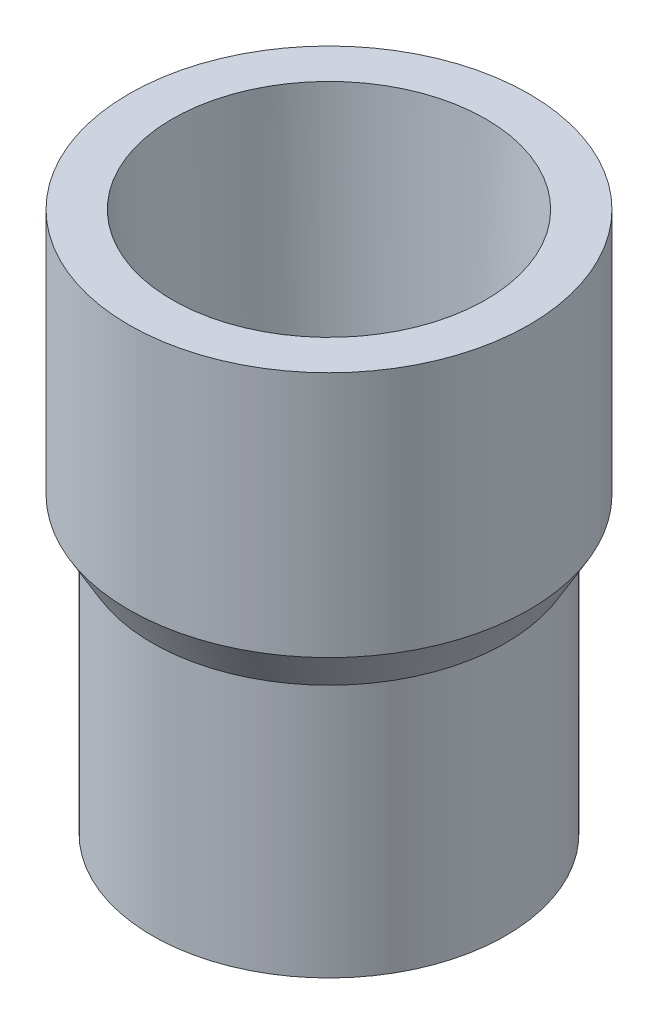
ISO-10303-21;
HEADER;
FILE_DESCRIPTION(('STEP AP214'),'2;1');
FILE_NAME('part.step','',(''),(''),'','','');
FILE_SCHEMA(('AUTOMOTIVE_DESIGN { 1 0 10303 214 1 1 1 1 }'));
ENDSEC;
DATA;
#1=APPLICATION_CONTEXT('core data for automotive mechanical design processes');
#2=APPLICATION_PROTOCOL_DEFINITION('international standard','automotive_design',2000,#1);
#3=PRODUCT_CONTEXT('',#1,'mechanical');
#4=PRODUCT('Part','Part','',(#3));
#5=PRODUCT_RELATED_PRODUCT_CATEGORY('part','',(#4));
#6=PRODUCT_DEFINITION_FORMATION('','',#4);
#7=PRODUCT_DEFINITION_CONTEXT('part definition',#1,'design');
#8=PRODUCT_DEFINITION('design','',#6,#7);
#9=PRODUCT_DEFINITION_SHAPE('','',#8);
#10=(LENGTH_UNIT() NAMED_UNIT(*) SI_UNIT(.MILLI.,.METRE.));
#11=(NAMED_UNIT(*) PLANE_ANGLE_UNIT() SI_UNIT($,.RADIAN.));
#12=(NAMED_UNIT(*) SI_UNIT($,.STERADIAN.) SOLID_ANGLE_UNIT());
#13=UNCERTAINTY_MEASURE_WITH_UNIT(LENGTH_MEASURE(1.E-05),#10,'distance_accuracy_value','');
#14=(GEOMETRIC_REPRESENTATION_CONTEXT(3) GLOBAL_UNCERTAINTY_ASSIGNED_CONTEXT((#13)) GLOBAL_UNIT_ASSIGNED_CONTEXT((#10,
#11,#12)) REPRESENTATION_CONTEXT('',''));
#15=CARTESIAN_POINT('',(0.,0.,0.));
#16=DIRECTION('',(0.,0.,1.));
#17=DIRECTION('',(1.,0.,0.));
#18=AXIS2_PLACEMENT_3D('',#15,#16,#17);
#19=CARTESIAN_POINT('',(10.25,-14.2848223435476,0.));
#20=DIRECTION('',(0.,-1.,0.));
#21=DIRECTION('',(0.,0.,-1.));
#22=AXIS2_PLACEMENT_3D('',#19,#20,#21);
#23=PLANE('',#22);
#24=CARTESIAN_POINT('',(0.,-14.2848223435476,0.));
#25=DIRECTION('',(0.,-1.,0.));
#26=DIRECTION('',(0.,0.,-1.));
#27=AXIS2_PLACEMENT_3D('',#24,#25,#26);
#28=CIRCLE('',#27,13.25);
#29=CARTESIAN_POINT('',(0.,-14.2848223435476,-13.25));
#30=VERTEX_POINT('',#29);
#31=EDGE_CURVE('E10',#30,#30,#28,.T.);
#32=ORIENTED_EDGE('',*,*,#31,.T.);
#33=EDGE_LOOP('',(#32));
#34=FACE_BOUND('',#33,.T.);
#35=CARTESIAN_POINT('',(0.,-14.2848223435476,0.));
#36=DIRECTION('',(0.,-1.,0.));
#37=DIRECTION('',(0.,0.,-1.));
#38=AXIS2_PLACEMENT_3D('',#35,#36,#37);
#39=CIRCLE('',#38,10.25);
#40=CARTESIAN_POINT('',(0.,-14.2848223435476,-10.25));
#41=VERTEX_POINT('',#40);
#42=EDGE_CURVE('E65',#41,#41,#39,.T.);
#43=ORIENTED_EDGE('',*,*,#42,.F.);
#44=EDGE_LOOP('',(#43));
#45=FACE_BOUND('',#44,.T.);
#46=ADVANCED_FACE('F31',(#34,#45),#23,.T.);
#47=CARTESIAN_POINT('',(0.,0.,0.));
#48=DIRECTION('',(0.,-1.,0.));
#49=DIRECTION('',(0.,0.,-1.));
#50=AXIS2_PLACEMENT_3D('',#47,#48,#49);
#51=CYLINDRICAL_SURFACE('',#50,13.25);
#52=CARTESIAN_POINT('',(0.,4.71873046153348,0.));
#53=DIRECTION('',(0.,-1.,0.));
#54=DIRECTION('',(0.,0.,-1.));
#55=AXIS2_PLACEMENT_3D('',#52,#53,#54);
#56=CIRCLE('',#55,13.25);
#57=CARTESIAN_POINT('',(0.,4.71873046153348,-13.25));
#58=VERTEX_POINT('',#57);
#59=EDGE_CURVE('E37',#58,#58,#56,.T.);
#60=ORIENTED_EDGE('',*,*,#59,.T.);
#61=EDGE_LOOP('',(#60));
#62=FACE_BOUND('',#61,.T.);
#63=ORIENTED_EDGE('',*,*,#31,.F.);
#64=EDGE_LOOP('',(#63));
#65=FACE_BOUND('',#64,.T.);
#66=ADVANCED_FACE('F73',(#62,#65),#51,.T.);
#67=CARTESIAN_POINT('',(0.,4.71873046153348,0.));
#68=DIRECTION('',(0.,1.,0.));
#69=DIRECTION('',(0.,0.,1.));
#70=AXIS2_PLACEMENT_3D('',#67,#68,#69);
#71=CONICAL_SURFACE('',#70,13.25,0.523598775598299);
#72=CARTESIAN_POINT('',(0.,7.74981937477901,0.));
#73=DIRECTION('',(0.,-1.,0.));
#74=DIRECTION('',(0.,0.,-1.));
#75=AXIS2_PLACEMENT_3D('',#72,#73,#74);
#76=CIRCLE('',#75,15.);
#77=CARTESIAN_POINT('',(0.,7.74981937477901,-15.));
#78=VERTEX_POINT('',#77);
#79=EDGE_CURVE('E41',#78,#78,#76,.T.);
#80=ORIENTED_EDGE('',*,*,#79,.T.);
#81=EDGE_LOOP('',(#80));
#82=FACE_BOUND('',#81,.T.);
#83=ORIENTED_EDGE('',*,*,#59,.F.);
#84=EDGE_LOOP('',(#83));
#85=FACE_BOUND('',#84,.T.);
#86=ADVANCED_FACE('F77',(#82,#85),#71,.T.);
#87=CARTESIAN_POINT('',(0.,0.,0.));
#88=DIRECTION('',(0.,-1.,0.));
#89=DIRECTION('',(0.,0.,-1.));
#90=AXIS2_PLACEMENT_3D('',#87,#88,#89);
#91=CYLINDRICAL_SURFACE('',#90,15.);
#92=CARTESIAN_POINT('',(0.,26.2426613100257,0.));
#93=DIRECTION('',(0.,-1.,0.));
#94=DIRECTION('',(0.,0.,-1.));
#95=AXIS2_PLACEMENT_3D('',#92,#93,#94);
#96=CIRCLE('',#95,15.);
#97=CARTESIAN_POINT('',(0.,26.2426613100257,-15.));
#98=VERTEX_POINT('',#97);
#99=EDGE_CURVE('E45',#98,#98,#96,.T.);
#100=ORIENTED_EDGE('',*,*,#99,.T.);
#101=EDGE_LOOP('',(#100));
#102=FACE_BOUND('',#101,.T.);
#103=ORIENTED_EDGE('',*,*,#79,.F.);
#104=EDGE_LOOP('',(#103));
#105=FACE_BOUND('',#104,.T.);
#106=ADVANCED_FACE('F81',(#102,#105),#91,.T.);
#107=CARTESIAN_POINT('',(15.,26.2426613100257,0.));
#108=DIRECTION('',(0.,1.,0.));
#109=DIRECTION('',(0.,0.,1.));
#110=AXIS2_PLACEMENT_3D('',#107,#108,#109);
#111=PLANE('',#110);
#112=CARTESIAN_POINT('',(0.,26.2426613100257,0.));
#113=DIRECTION('',(0.,-1.,0.));
#114=DIRECTION('',(0.,0.,-1.));
#115=AXIS2_PLACEMENT_3D('',#112,#113,#114);
#116=CIRCLE('',#115,11.75);
#117=CARTESIAN_POINT('',(0.,26.2426613100257,-11.75));
#118=VERTEX_POINT('',#117);
#119=EDGE_CURVE('E50',#118,#118,#116,.T.);
#120=ORIENTED_EDGE('',*,*,#119,.T.);
#121=EDGE_LOOP('',(#120));
#122=FACE_BOUND('',#121,.T.);
#123=ORIENTED_EDGE('',*,*,#99,.F.);
#124=EDGE_LOOP('',(#123));
#125=FACE_BOUND('',#124,.T.);
#126=ADVANCED_FACE('F88',(#122,#125),#111,.T.);
#127=CARTESIAN_POINT('',(0.,26.2426613100257,0.));
#128=DIRECTION('',(0.,1.,0.));
#129=DIRECTION('',(0.,0.,1.));
#130=AXIS2_PLACEMENT_3D('',#127,#128,#129);
#131=CONICAL_SURFACE('',#130,11.75,0.0374824366916615);
#132=CARTESIAN_POINT('',(0.,6.24266131002571,0.));
#133=DIRECTION('',(0.,-1.,0.));
#134=DIRECTION('',(0.,0.,-1.));
#135=AXIS2_PLACEMENT_3D('',#132,#133,#134);
#136=CIRCLE('',#135,11.);
#137=CARTESIAN_POINT('',(0.,6.24266131002571,-11.));
#138=VERTEX_POINT('',#137);
#139=EDGE_CURVE('E53',#138,#138,#136,.T.);
#140=ORIENTED_EDGE('',*,*,#139,.T.);
#141=EDGE_LOOP('',(#140));
#142=FACE_BOUND('',#141,.T.);
#143=ORIENTED_EDGE('',*,*,#119,.F.);
#144=EDGE_LOOP('',(#143));
#145=FACE_BOUND('',#144,.T.);
#146=ADVANCED_FACE('F92',(#142,#145),#131,.F.);
#147=CARTESIAN_POINT('',(0.,0.,0.));
#148=DIRECTION('',(0.,-1.,0.));
#149=DIRECTION('',(0.,0.,-1.));
#150=AXIS2_PLACEMENT_3D('',#147,#148,#149);
#151=CYLINDRICAL_SURFACE('',#150,11.);
#152=CARTESIAN_POINT('',(0.,1.24266131002571,0.));
#153=DIRECTION('',(0.,-1.,0.));
#154=DIRECTION('',(0.,0.,-1.));
#155=AXIS2_PLACEMENT_3D('',#152,#153,#154);
#156=CIRCLE('',#155,11.);
#157=CARTESIAN_POINT('',(0.,1.24266131002571,-11.));
#158=VERTEX_POINT('',#157);
#159=EDGE_CURVE('E56',#158,#158,#156,.T.);
#160=ORIENTED_EDGE('',*,*,#159,.T.);
#161=EDGE_LOOP('',(#160));
#162=FACE_BOUND('',#161,.T.);
#163=ORIENTED_EDGE('',*,*,#139,.F.);
#164=EDGE_LOOP('',(#163));
#165=FACE_BOUND('',#164,.T.);
#166=ADVANCED_FACE('F96',(#162,#165),#151,.F.);
#167=CARTESIAN_POINT('',(11.,1.24266131002571,0.));
#168=DIRECTION('',(0.,1.,0.));
#169=DIRECTION('',(0.,0.,1.));
#170=AXIS2_PLACEMENT_3D('',#167,#168,#169);
#171=PLANE('',#170);
#172=CARTESIAN_POINT('',(0.,1.24266131002571,0.));
#173=DIRECTION('',(0.,-1.,0.));
#174=DIRECTION('',(0.,0.,-1.));
#175=AXIS2_PLACEMENT_3D('',#172,#173,#174);
#176=CIRCLE('',#175,9.8);
#177=CARTESIAN_POINT('',(0.,1.24266131002571,-9.8));
#178=VERTEX_POINT('',#177);
#179=EDGE_CURVE('E59',#178,#178,#176,.T.);
#180=ORIENTED_EDGE('',*,*,#179,.T.);
#181=EDGE_LOOP('',(#180));
#182=FACE_BOUND('',#181,.T.);
#183=ORIENTED_EDGE('',*,*,#159,.F.);
#184=EDGE_LOOP('',(#183));
#185=FACE_BOUND('',#184,.T.);
#186=ADVANCED_FACE('F100',(#182,#185),#171,.T.);
#187=CARTESIAN_POINT('',(0.,0.,0.));
#188=DIRECTION('',(0.,-1.,0.));
#189=DIRECTION('',(0.,0.,-1.));
#190=AXIS2_PLACEMENT_3D('',#187,#188,#189);
#191=CYLINDRICAL_SURFACE('',#190,9.8);
#192=CARTESIAN_POINT('',(0.,0.715177656452379,0.));
#193=DIRECTION('',(0.,-1.,0.));
#194=DIRECTION('',(0.,0.,-1.));
#195=AXIS2_PLACEMENT_3D('',#192,#193,#194);
#196=CIRCLE('',#195,9.8);
#197=CARTESIAN_POINT('',(0.,0.715177656452379,-9.8));
#198=VERTEX_POINT('',#197);
#199=EDGE_CURVE('E62',#198,#198,#196,.T.);
#200=ORIENTED_EDGE('',*,*,#199,.T.);
#201=EDGE_LOOP('',(#200));
#202=FACE_BOUND('',#201,.T.);
#203=ORIENTED_EDGE('',*,*,#179,.F.);
#204=EDGE_LOOP('',(#203));
#205=FACE_BOUND('',#204,.T.);
#206=ADVANCED_FACE('F104',(#202,#205),#191,.F.);
#207=CARTESIAN_POINT('',(0.,0.715177656452379,0.));
#208=DIRECTION('',(0.,-1.,0.));
#209=DIRECTION('',(0.,0.,-1.));
#210=AXIS2_PLACEMENT_3D('',#207,#208,#209);
#211=CONICAL_SURFACE('',#210,9.8,0.029991004856878);
#212=ORIENTED_EDGE('',*,*,#42,.T.);
#213=EDGE_LOOP('',(#212));
#214=FACE_BOUND('',#213,.T.);
#215=ORIENTED_EDGE('',*,*,#199,.F.);
#216=EDGE_LOOP('',(#215));
#217=FACE_BOUND('',#216,.T.);
#218=ADVANCED_FACE('F69',(#214,#217),#211,.F.);
#219=CLOSED_SHELL('',(#46,#66,#86,#106,#126,#146,#166,#186,#206,#218));
#220=MANIFOLD_SOLID_BREP('B2',#219);
#221=ADVANCED_BREP_SHAPE_REPRESENTATION('',(#18,#220),#14);
#222=SHAPE_DEFINITION_REPRESENTATION(#9,#221);
ENDSEC;
END-ISO-10303-21;
